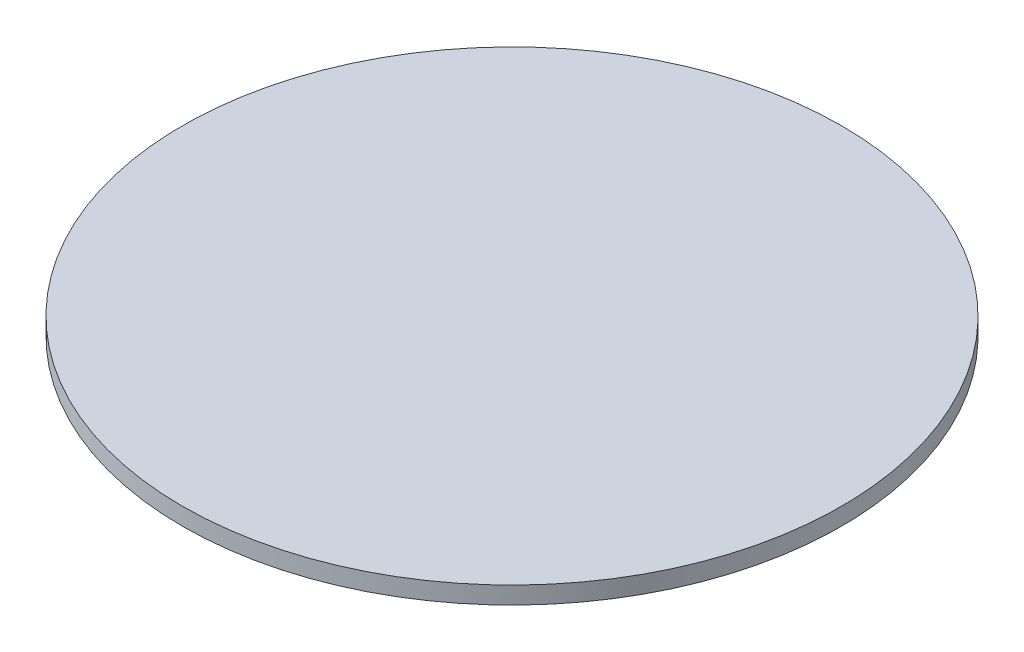
ISO-10303-21;
HEADER;
FILE_DESCRIPTION(('STEP AP214'),'2;1');
FILE_NAME('part.step','',(''),(''),'','','');
FILE_SCHEMA(('AUTOMOTIVE_DESIGN { 1 0 10303 214 1 1 1 1 }'));
ENDSEC;
DATA;
#1=APPLICATION_CONTEXT('core data for automotive mechanical design processes');
#2=APPLICATION_PROTOCOL_DEFINITION('international standard','automotive_design',2000,#1);
#3=PRODUCT_CONTEXT('',#1,'mechanical');
#4=PRODUCT('Part','Part','',(#3));
#5=PRODUCT_RELATED_PRODUCT_CATEGORY('part','',(#4));
#6=PRODUCT_DEFINITION_FORMATION('','',#4);
#7=PRODUCT_DEFINITION_CONTEXT('part definition',#1,'design');
#8=PRODUCT_DEFINITION('design','',#6,#7);
#9=PRODUCT_DEFINITION_SHAPE('','',#8);
#10=(LENGTH_UNIT() NAMED_UNIT(*) SI_UNIT(.MILLI.,.METRE.));
#11=(NAMED_UNIT(*) PLANE_ANGLE_UNIT() SI_UNIT($,.RADIAN.));
#12=(NAMED_UNIT(*) SI_UNIT($,.STERADIAN.) SOLID_ANGLE_UNIT());
#13=UNCERTAINTY_MEASURE_WITH_UNIT(LENGTH_MEASURE(1.E-05),#10,'distance_accuracy_value','');
#14=(GEOMETRIC_REPRESENTATION_CONTEXT(3) GLOBAL_UNCERTAINTY_ASSIGNED_CONTEXT((#13)) GLOBAL_UNIT_ASSIGNED_CONTEXT((#10,
#11,#12)) REPRESENTATION_CONTEXT('',''));
#15=CARTESIAN_POINT('',(0.,0.,0.));
#16=DIRECTION('',(0.,0.,1.));
#17=DIRECTION('',(1.,0.,0.));
#18=AXIS2_PLACEMENT_3D('',#15,#16,#17);
#19=CARTESIAN_POINT('',(0.,1.,0.));
#20=DIRECTION('',(0.,-1.,0.));
#21=DIRECTION('',(0.,0.,-1.));
#22=AXIS2_PLACEMENT_3D('',#19,#20,#21);
#23=CYLINDRICAL_SURFACE('',#22,19.);
#24=CARTESIAN_POINT('',(0.,1.,0.));
#25=DIRECTION('',(0.,1.,0.));
#26=DIRECTION('',(0.,0.,1.));
#27=AXIS2_PLACEMENT_3D('',#24,#25,#26);
#28=CIRCLE('',#27,19.);
#29=CARTESIAN_POINT('',(0.,1.,19.));
#30=VERTEX_POINT('',#29);
#31=EDGE_CURVE('E10',#30,#30,#28,.T.);
#32=ORIENTED_EDGE('',*,*,#31,.F.);
#33=EDGE_LOOP('',(#32));
#34=FACE_BOUND('',#33,.T.);
#35=CARTESIAN_POINT('',(0.,0.,0.));
#36=DIRECTION('',(0.,1.,0.));
#37=DIRECTION('',(0.,0.,1.));
#38=AXIS2_PLACEMENT_3D('',#35,#36,#37);
#39=CIRCLE('',#38,19.);
#40=CARTESIAN_POINT('',(0.,0.,19.));
#41=VERTEX_POINT('',#40);
#42=EDGE_CURVE('E44',#41,#41,#39,.T.);
#43=ORIENTED_EDGE('',*,*,#42,.T.);
#44=EDGE_LOOP('',(#43));
#45=FACE_BOUND('',#44,.T.);
#46=ADVANCED_FACE('F41',(#34,#45),#23,.T.);
#47=CARTESIAN_POINT('',(0.,1.,0.));
#48=DIRECTION('',(0.,1.,0.));
#49=DIRECTION('',(0.,0.,1.));
#50=AXIS2_PLACEMENT_3D('',#47,#48,#49);
#51=PLANE('',#50);
#52=ORIENTED_EDGE('',*,*,#31,.T.);
#53=EDGE_LOOP('',(#52));
#54=FACE_BOUND('',#53,.T.);
#55=ADVANCED_FACE('F56',(#54),#51,.T.);
#56=CARTESIAN_POINT('',(0.,0.,0.));
#57=DIRECTION('',(0.,1.,0.));
#58=DIRECTION('',(0.,0.,1.));
#59=AXIS2_PLACEMENT_3D('',#56,#57,#58);
#60=PLANE('',#59);
#61=ORIENTED_EDGE('',*,*,#42,.F.);
#62=EDGE_LOOP('',(#61));
#63=FACE_BOUND('',#62,.T.);
#64=ADVANCED_FACE('F54',(#63),#60,.F.);
#65=CLOSED_SHELL('',(#46,#55,#64));
#66=MANIFOLD_SOLID_BREP('B2',#65);
#67=ADVANCED_BREP_SHAPE_REPRESENTATION('',(#18,#66),#14);
#68=SHAPE_DEFINITION_REPRESENTATION(#9,#67);
ENDSEC;
END-ISO-10303-21;
